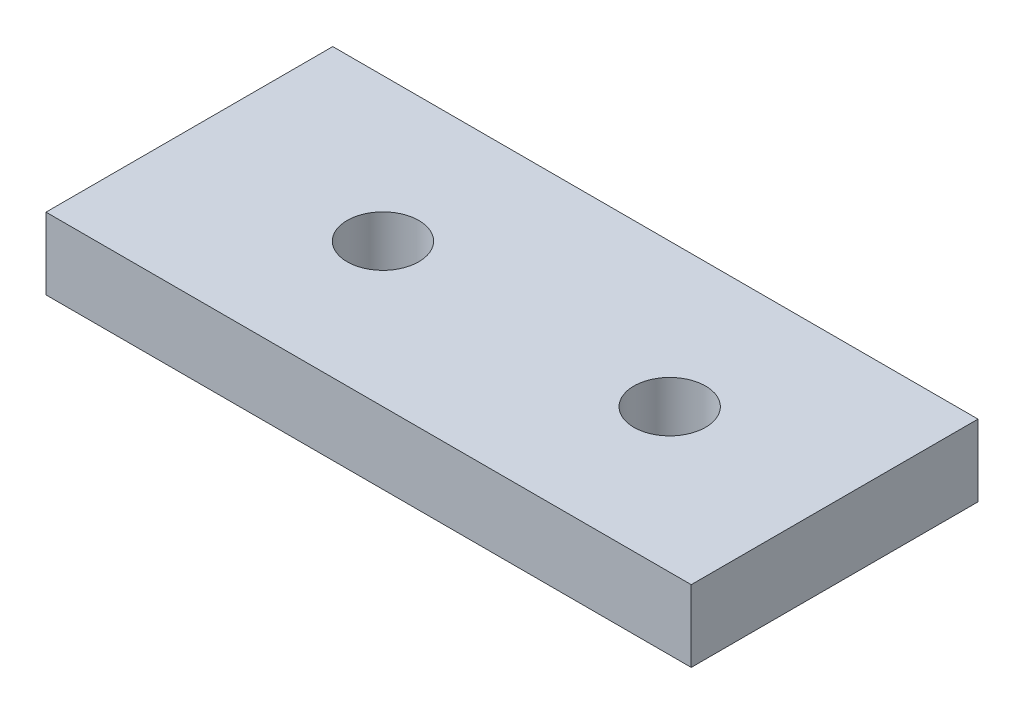
ISO-10303-21;
HEADER;
FILE_DESCRIPTION(('STEP AP214'),'2;1');
FILE_NAME('part.step','',(''),(''),'','','');
FILE_SCHEMA(('AUTOMOTIVE_DESIGN { 1 0 10303 214 1 1 1 1 }'));
ENDSEC;
DATA;
#1=APPLICATION_CONTEXT('core data for automotive mechanical design processes');
#2=APPLICATION_PROTOCOL_DEFINITION('international standard','automotive_design',2000,#1);
#3=PRODUCT_CONTEXT('',#1,'mechanical');
#4=PRODUCT('Part','Part','',(#3));
#5=PRODUCT_RELATED_PRODUCT_CATEGORY('part','',(#4));
#6=PRODUCT_DEFINITION_FORMATION('','',#4);
#7=PRODUCT_DEFINITION_CONTEXT('part definition',#1,'design');
#8=PRODUCT_DEFINITION('design','',#6,#7);
#9=PRODUCT_DEFINITION_SHAPE('','',#8);
#10=(LENGTH_UNIT() NAMED_UNIT(*) SI_UNIT(.MILLI.,.METRE.));
#11=(NAMED_UNIT(*) PLANE_ANGLE_UNIT() SI_UNIT($,.RADIAN.));
#12=(NAMED_UNIT(*) SI_UNIT($,.STERADIAN.) SOLID_ANGLE_UNIT());
#13=UNCERTAINTY_MEASURE_WITH_UNIT(LENGTH_MEASURE(1.E-05),#10,'distance_accuracy_value','');
#14=(GEOMETRIC_REPRESENTATION_CONTEXT(3) GLOBAL_UNCERTAINTY_ASSIGNED_CONTEXT((#13)) GLOBAL_UNIT_ASSIGNED_CONTEXT((#10,
#11,#12)) REPRESENTATION_CONTEXT('',''));
#15=CARTESIAN_POINT('',(0.,0.,0.));
#16=DIRECTION('',(0.,0.,1.));
#17=DIRECTION('',(1.,0.,0.));
#18=AXIS2_PLACEMENT_3D('',#15,#16,#17);
#19=CARTESIAN_POINT('',(0.,10.,0.));
#20=DIRECTION('',(0.,-1.,0.));
#21=DIRECTION('',(0.,0.,-1.));
#22=AXIS2_PLACEMENT_3D('',#19,#20,#21);
#23=PLANE('',#22);
#24=DIRECTION('',(0.,0.,1.));
#25=VECTOR('',#24,1.);
#26=CARTESIAN_POINT('',(0.,10.,0.));
#27=LINE('',#26,#25);
#28=CARTESIAN_POINT('',(0.,10.,-40.));
#29=VERTEX_POINT('',#28);
#30=CARTESIAN_POINT('',(0.,10.,0.));
#31=VERTEX_POINT('',#30);
#32=EDGE_CURVE('E96',#29,#31,#27,.T.);
#33=ORIENTED_EDGE('',*,*,#32,.T.);
#34=DIRECTION('',(1.,0.,0.));
#35=VECTOR('',#34,1.);
#36=CARTESIAN_POINT('',(0.,10.,0.));
#37=LINE('',#36,#35);
#38=CARTESIAN_POINT('',(90.,10.,0.));
#39=VERTEX_POINT('',#38);
#40=EDGE_CURVE('E91',#31,#39,#37,.T.);
#41=ORIENTED_EDGE('',*,*,#40,.T.);
#42=DIRECTION('',(0.,0.,-1.));
#43=VECTOR('',#42,1.);
#44=CARTESIAN_POINT('',(90.,10.,0.));
#45=LINE('',#44,#43);
#46=CARTESIAN_POINT('',(90.,10.,-40.));
#47=VERTEX_POINT('',#46);
#48=EDGE_CURVE('E94',#39,#47,#45,.T.);
#49=ORIENTED_EDGE('',*,*,#48,.T.);
#50=DIRECTION('',(-1.,0.,0.));
#51=VECTOR('',#50,1.);
#52=CARTESIAN_POINT('',(0.,10.,-40.));
#53=LINE('',#52,#51);
#54=EDGE_CURVE('E61',#47,#29,#53,.T.);
#55=ORIENTED_EDGE('',*,*,#54,.T.);
#56=EDGE_LOOP('',(#33,#41,#49,#55));
#57=FACE_BOUND('',#56,.T.);
#58=CARTESIAN_POINT('',(27.,10.,-20.));
#59=DIRECTION('',(0.,1.,0.));
#60=DIRECTION('',(0.,0.,1.));
#61=AXIS2_PLACEMENT_3D('',#58,#59,#60);
#62=CIRCLE('',#61,5.);
#63=CARTESIAN_POINT('',(27.,10.,-15.));
#64=VERTEX_POINT('',#63);
#65=EDGE_CURVE('E116',#64,#64,#62,.T.);
#66=ORIENTED_EDGE('',*,*,#65,.F.);
#67=EDGE_LOOP('',(#66));
#68=FACE_BOUND('',#67,.T.);
#69=CARTESIAN_POINT('',(67.,10.,-20.));
#70=DIRECTION('',(0.,1.,0.));
#71=DIRECTION('',(0.,0.,1.));
#72=AXIS2_PLACEMENT_3D('',#69,#70,#71);
#73=CIRCLE('',#72,5.);
#74=CARTESIAN_POINT('',(67.,10.,-15.));
#75=VERTEX_POINT('',#74);
#76=EDGE_CURVE('E138',#75,#75,#73,.T.);
#77=ORIENTED_EDGE('',*,*,#76,.F.);
#78=EDGE_LOOP('',(#77));
#79=FACE_BOUND('',#78,.T.);
#80=ADVANCED_FACE('F43',(#57,#68,#79),#23,.F.);
#81=CARTESIAN_POINT('',(0.,0.,0.));
#82=DIRECTION('',(0.,-1.,0.));
#83=DIRECTION('',(0.,0.,-1.));
#84=AXIS2_PLACEMENT_3D('',#81,#82,#83);
#85=PLANE('',#84);
#86=CARTESIAN_POINT('',(27.,0.,-20.));
#87=DIRECTION('',(0.,1.,0.));
#88=DIRECTION('',(0.,0.,1.));
#89=AXIS2_PLACEMENT_3D('',#86,#87,#88);
#90=CIRCLE('',#89,5.);
#91=CARTESIAN_POINT('',(27.,0.,-15.));
#92=VERTEX_POINT('',#91);
#93=EDGE_CURVE('E134',#92,#92,#90,.T.);
#94=ORIENTED_EDGE('',*,*,#93,.T.);
#95=EDGE_LOOP('',(#94));
#96=FACE_BOUND('',#95,.T.);
#97=DIRECTION('',(0.,0.,1.));
#98=VECTOR('',#97,1.);
#99=CARTESIAN_POINT('',(0.,0.,0.));
#100=LINE('',#99,#98);
#101=CARTESIAN_POINT('',(0.,0.,-40.));
#102=VERTEX_POINT('',#101);
#103=CARTESIAN_POINT('',(0.,0.,0.));
#104=VERTEX_POINT('',#103);
#105=EDGE_CURVE('E112',#102,#104,#100,.T.);
#106=ORIENTED_EDGE('',*,*,#105,.F.);
#107=DIRECTION('',(-1.,0.,0.));
#108=VECTOR('',#107,1.);
#109=CARTESIAN_POINT('',(0.,0.,-40.));
#110=LINE('',#109,#108);
#111=CARTESIAN_POINT('',(90.,0.,-40.));
#112=VERTEX_POINT('',#111);
#113=EDGE_CURVE('E84',#112,#102,#110,.T.);
#114=ORIENTED_EDGE('',*,*,#113,.F.);
#115=DIRECTION('',(0.,0.,-1.));
#116=VECTOR('',#115,1.);
#117=CARTESIAN_POINT('',(90.,0.,0.));
#118=LINE('',#117,#116);
#119=CARTESIAN_POINT('',(90.,0.,0.));
#120=VERTEX_POINT('',#119);
#121=EDGE_CURVE('E78',#120,#112,#118,.T.);
#122=ORIENTED_EDGE('',*,*,#121,.F.);
#123=DIRECTION('',(1.,0.,0.));
#124=VECTOR('',#123,1.);
#125=CARTESIAN_POINT('',(0.,0.,0.));
#126=LINE('',#125,#124);
#127=EDGE_CURVE('E101',#104,#120,#126,.T.);
#128=ORIENTED_EDGE('',*,*,#127,.F.);
#129=EDGE_LOOP('',(#106,#114,#122,#128));
#130=FACE_BOUND('',#129,.T.);
#131=CARTESIAN_POINT('',(67.,0.,-20.));
#132=DIRECTION('',(0.,1.,0.));
#133=DIRECTION('',(0.,0.,1.));
#134=AXIS2_PLACEMENT_3D('',#131,#132,#133);
#135=CIRCLE('',#134,5.);
#136=CARTESIAN_POINT('',(67.,0.,-15.));
#137=VERTEX_POINT('',#136);
#138=EDGE_CURVE('E142',#137,#137,#135,.T.);
#139=ORIENTED_EDGE('',*,*,#138,.T.);
#140=EDGE_LOOP('',(#139));
#141=FACE_BOUND('',#140,.T.);
#142=ADVANCED_FACE('F129',(#96,#130,#141),#85,.T.);
#143=CARTESIAN_POINT('',(0.,10.,0.));
#144=DIRECTION('',(1.,0.,0.));
#145=DIRECTION('',(0.,0.,-1.));
#146=AXIS2_PLACEMENT_3D('',#143,#144,#145);
#147=PLANE('',#146);
#148=ORIENTED_EDGE('',*,*,#105,.T.);
#149=DIRECTION('',(0.,-1.,0.));
#150=VECTOR('',#149,1.);
#151=CARTESIAN_POINT('',(0.,10.,0.));
#152=LINE('',#151,#150);
#153=EDGE_CURVE('E11',#31,#104,#152,.T.);
#154=ORIENTED_EDGE('',*,*,#153,.F.);
#155=ORIENTED_EDGE('',*,*,#32,.F.);
#156=DIRECTION('',(0.,-1.,0.));
#157=VECTOR('',#156,1.);
#158=CARTESIAN_POINT('',(0.,10.,-40.));
#159=LINE('',#158,#157);
#160=EDGE_CURVE('E108',#29,#102,#159,.T.);
#161=ORIENTED_EDGE('',*,*,#160,.T.);
#162=EDGE_LOOP('',(#148,#154,#155,#161));
#163=FACE_BOUND('',#162,.T.);
#164=ADVANCED_FACE('F45',(#163),#147,.F.);
#165=CARTESIAN_POINT('',(0.,10.,0.));
#166=DIRECTION('',(0.,0.,-1.));
#167=DIRECTION('',(-1.,0.,0.));
#168=AXIS2_PLACEMENT_3D('',#165,#166,#167);
#169=PLANE('',#168);
#170=ORIENTED_EDGE('',*,*,#127,.T.);
#171=DIRECTION('',(0.,-1.,0.));
#172=VECTOR('',#171,1.);
#173=CARTESIAN_POINT('',(90.,10.,0.));
#174=LINE('',#173,#172);
#175=EDGE_CURVE('E53',#39,#120,#174,.T.);
#176=ORIENTED_EDGE('',*,*,#175,.F.);
#177=ORIENTED_EDGE('',*,*,#40,.F.);
#178=ORIENTED_EDGE('',*,*,#153,.T.);
#179=EDGE_LOOP('',(#170,#176,#177,#178));
#180=FACE_BOUND('',#179,.T.);
#181=ADVANCED_FACE('F100',(#180),#169,.F.);
#182=CARTESIAN_POINT('',(90.,10.,0.));
#183=DIRECTION('',(-1.,0.,0.));
#184=DIRECTION('',(0.,0.,1.));
#185=AXIS2_PLACEMENT_3D('',#182,#183,#184);
#186=PLANE('',#185);
#187=ORIENTED_EDGE('',*,*,#121,.T.);
#188=DIRECTION('',(0.,-1.,0.));
#189=VECTOR('',#188,1.);
#190=CARTESIAN_POINT('',(90.,10.,-40.));
#191=LINE('',#190,#189);
#192=EDGE_CURVE('E103',#47,#112,#191,.T.);
#193=ORIENTED_EDGE('',*,*,#192,.F.);
#194=ORIENTED_EDGE('',*,*,#48,.F.);
#195=ORIENTED_EDGE('',*,*,#175,.T.);
#196=EDGE_LOOP('',(#187,#193,#194,#195));
#197=FACE_BOUND('',#196,.T.);
#198=ADVANCED_FACE('F104',(#197),#186,.F.);
#199=CARTESIAN_POINT('',(0.,10.,-40.));
#200=DIRECTION('',(0.,0.,1.));
#201=DIRECTION('',(1.,0.,0.));
#202=AXIS2_PLACEMENT_3D('',#199,#200,#201);
#203=PLANE('',#202);
#204=ORIENTED_EDGE('',*,*,#113,.T.);
#205=ORIENTED_EDGE('',*,*,#160,.F.);
#206=ORIENTED_EDGE('',*,*,#54,.F.);
#207=ORIENTED_EDGE('',*,*,#192,.T.);
#208=EDGE_LOOP('',(#204,#205,#206,#207));
#209=FACE_BOUND('',#208,.T.);
#210=ADVANCED_FACE('F126',(#209),#203,.F.);
#211=CARTESIAN_POINT('',(27.,10.,-20.));
#212=DIRECTION('',(0.,-1.,0.));
#213=DIRECTION('',(0.,0.,-1.));
#214=AXIS2_PLACEMENT_3D('',#211,#212,#213);
#215=CYLINDRICAL_SURFACE('',#214,5.);
#216=ORIENTED_EDGE('',*,*,#65,.T.);
#217=EDGE_LOOP('',(#216));
#218=FACE_BOUND('',#217,.T.);
#219=ORIENTED_EDGE('',*,*,#93,.F.);
#220=EDGE_LOOP('',(#219));
#221=FACE_BOUND('',#220,.T.);
#222=ADVANCED_FACE('F161',(#218,#221),#215,.F.);
#223=CARTESIAN_POINT('',(67.,10.,-20.));
#224=DIRECTION('',(0.,-1.,0.));
#225=DIRECTION('',(0.,0.,-1.));
#226=AXIS2_PLACEMENT_3D('',#223,#224,#225);
#227=CYLINDRICAL_SURFACE('',#226,5.);
#228=ORIENTED_EDGE('',*,*,#76,.T.);
#229=EDGE_LOOP('',(#228));
#230=FACE_BOUND('',#229,.T.);
#231=ORIENTED_EDGE('',*,*,#138,.F.);
#232=EDGE_LOOP('',(#231));
#233=FACE_BOUND('',#232,.T.);
#234=ADVANCED_FACE('F150',(#230,#233),#227,.F.);
#235=CLOSED_SHELL('',(#80,#142,#164,#181,#198,#210,#222,#234));
#236=MANIFOLD_SOLID_BREP('B2',#235);
#237=ADVANCED_BREP_SHAPE_REPRESENTATION('',(#18,#236),#14);
#238=SHAPE_DEFINITION_REPRESENTATION(#9,#237);
ENDSEC;
END-ISO-10303-21;
